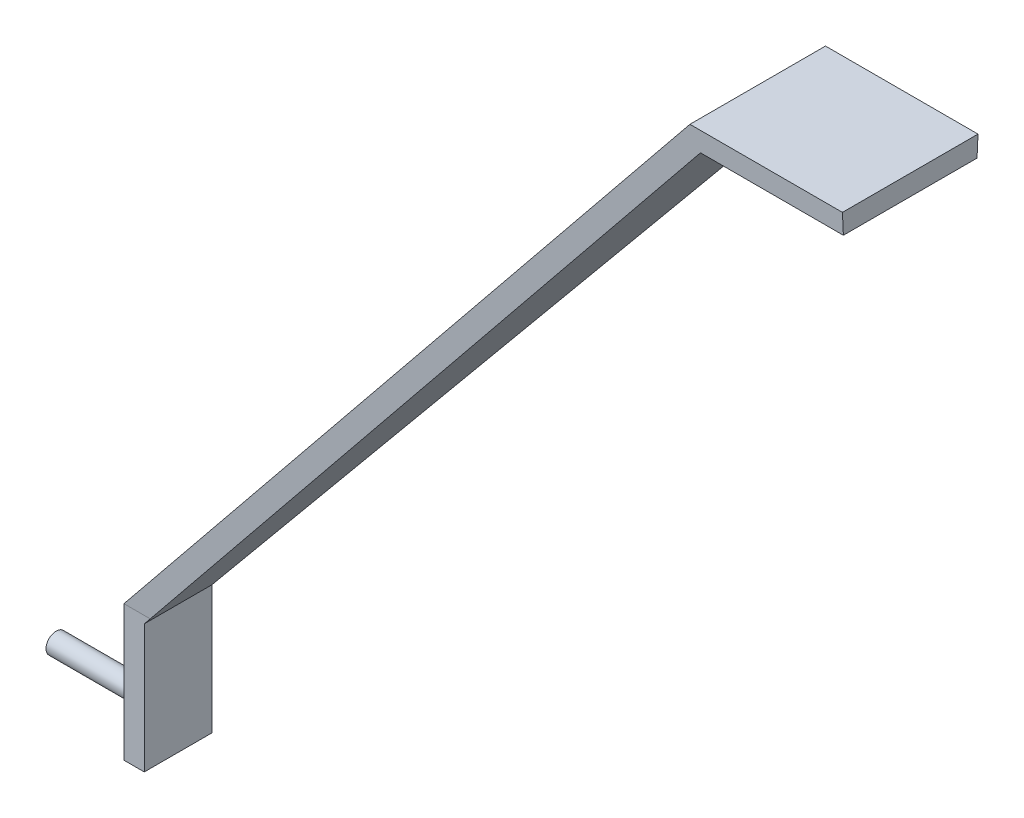
ISO-10303-21;
HEADER;
FILE_DESCRIPTION(('STEP AP214'),'2;1');
FILE_NAME('part.step','',(''),(''),'','','');
FILE_SCHEMA(('AUTOMOTIVE_DESIGN { 1 0 10303 214 1 1 1 1 }'));
ENDSEC;
DATA;
#1=APPLICATION_CONTEXT('core data for automotive mechanical design processes');
#2=APPLICATION_PROTOCOL_DEFINITION('international standard','automotive_design',2000,#1);
#3=PRODUCT_CONTEXT('',#1,'mechanical');
#4=PRODUCT('Part','Part','',(#3));
#5=PRODUCT_RELATED_PRODUCT_CATEGORY('part','',(#4));
#6=PRODUCT_DEFINITION_FORMATION('','',#4);
#7=PRODUCT_DEFINITION_CONTEXT('part definition',#1,'design');
#8=PRODUCT_DEFINITION('design','',#6,#7);
#9=PRODUCT_DEFINITION_SHAPE('','',#8);
#10=(LENGTH_UNIT() NAMED_UNIT(*) SI_UNIT(.MILLI.,.METRE.));
#11=(NAMED_UNIT(*) PLANE_ANGLE_UNIT() SI_UNIT($,.RADIAN.));
#12=(NAMED_UNIT(*) SI_UNIT($,.STERADIAN.) SOLID_ANGLE_UNIT());
#13=UNCERTAINTY_MEASURE_WITH_UNIT(LENGTH_MEASURE(1.E-05),#10,'distance_accuracy_value','');
#14=(GEOMETRIC_REPRESENTATION_CONTEXT(3) GLOBAL_UNCERTAINTY_ASSIGNED_CONTEXT((#13)) GLOBAL_UNIT_ASSIGNED_CONTEXT((#10,
#11,#12)) REPRESENTATION_CONTEXT('',''));
#15=CARTESIAN_POINT('',(0.,0.,0.));
#16=DIRECTION('',(0.,0.,1.));
#17=DIRECTION('',(1.,0.,0.));
#18=AXIS2_PLACEMENT_3D('',#15,#16,#17);
#19=CARTESIAN_POINT('',(0.,0.,20.));
#20=DIRECTION('',(0.,1.,0.));
#21=DIRECTION('',(0.,0.,1.));
#22=AXIS2_PLACEMENT_3D('',#19,#20,#21);
#23=PLANE('',#22);
#24=DIRECTION('',(1.,0.,0.));
#25=VECTOR('',#24,1.);
#26=CARTESIAN_POINT('',(0.,0.,20.));
#27=LINE('',#26,#25);
#28=CARTESIAN_POINT('',(-42.5,0.,20.));
#29=VERTEX_POINT('',#28);
#30=CARTESIAN_POINT('',(-19.9999999999999,0.,20.));
#31=VERTEX_POINT('',#30);
#32=EDGE_CURVE('E150',#29,#31,#27,.T.);
#33=ORIENTED_EDGE('',*,*,#32,.T.);
#34=DIRECTION('',(0.,0.,-1.));
#35=VECTOR('',#34,1.);
#36=CARTESIAN_POINT('',(-19.9999999999999,0.,20.));
#37=LINE('',#36,#35);
#38=CARTESIAN_POINT('',(-19.9999999999999,0.,0.));
#39=VERTEX_POINT('',#38);
#40=EDGE_CURVE('E54',#31,#39,#37,.T.);
#41=ORIENTED_EDGE('',*,*,#40,.T.);
#42=DIRECTION('',(1.,0.,0.));
#43=VECTOR('',#42,1.);
#44=CARTESIAN_POINT('',(0.,0.,0.));
#45=LINE('',#44,#43);
#46=CARTESIAN_POINT('',(-42.5,0.,0.));
#47=VERTEX_POINT('',#46);
#48=EDGE_CURVE('E149',#47,#39,#45,.T.);
#49=ORIENTED_EDGE('',*,*,#48,.F.);
#50=DIRECTION('',(0.,0.,-1.));
#51=VECTOR('',#50,1.);
#52=CARTESIAN_POINT('',(-42.5,0.,20.));
#53=LINE('',#52,#51);
#54=EDGE_CURVE('E167',#29,#47,#53,.T.);
#55=ORIENTED_EDGE('',*,*,#54,.F.);
#56=EDGE_LOOP('',(#33,#41,#49,#55));
#57=FACE_BOUND('',#56,.T.);
#58=ADVANCED_FACE('F41',(#57),#23,.T.);
#59=CARTESIAN_POINT('',(0.,-3.00000000000002,20.));
#60=DIRECTION('',(0.,-1.,0.));
#61=DIRECTION('',(0.,0.,-1.));
#62=AXIS2_PLACEMENT_3D('',#59,#60,#61);
#63=PLANE('',#62);
#64=DIRECTION('',(-1.,0.,0.));
#65=VECTOR('',#64,1.);
#66=CARTESIAN_POINT('',(0.,-3.00000000000002,0.13888888888889));
#67=LINE('',#66,#65);
#68=CARTESIAN_POINT('',(-19.9999999999999,-3.00000000000002,0.13888888888889));
#69=VERTEX_POINT('',#68);
#70=CARTESIAN_POINT('',(-41.0797507600499,-3.00000000000002,0.13888888888889));
#71=VERTEX_POINT('',#70);
#72=EDGE_CURVE('E122',#69,#71,#67,.T.);
#73=ORIENTED_EDGE('',*,*,#72,.F.);
#74=DIRECTION('',(0.,0.,1.));
#75=VECTOR('',#74,1.);
#76=CARTESIAN_POINT('',(-19.9999999999999,-3.00000000000002,20.));
#77=LINE('',#76,#75);
#78=CARTESIAN_POINT('',(-19.9999999999999,-3.00000000000002,19.8611111111111));
#79=VERTEX_POINT('',#78);
#80=EDGE_CURVE('E110',#69,#79,#77,.T.);
#81=ORIENTED_EDGE('',*,*,#80,.T.);
#82=DIRECTION('',(1.,0.,0.));
#83=VECTOR('',#82,1.);
#84=CARTESIAN_POINT('',(0.,-3.00000000000002,19.8611111111111));
#85=LINE('',#84,#83);
#86=CARTESIAN_POINT('',(-41.0797507600499,-3.00000000000002,19.8611111111111));
#87=VERTEX_POINT('',#86);
#88=EDGE_CURVE('E120',#87,#79,#85,.T.);
#89=ORIENTED_EDGE('',*,*,#88,.F.);
#90=DIRECTION('',(0.,0.,-1.));
#91=VECTOR('',#90,1.);
#92=CARTESIAN_POINT('',(-41.0797507600499,-3.00000000000002,20.));
#93=LINE('',#92,#91);
#94=EDGE_CURVE('E152',#87,#71,#93,.T.);
#95=ORIENTED_EDGE('',*,*,#94,.T.);
#96=EDGE_LOOP('',(#73,#81,#89,#95));
#97=FACE_BOUND('',#96,.T.);
#98=ADVANCED_FACE('F118',(#97),#63,.T.);
#99=CARTESIAN_POINT('',(-131.,0.,0.));
#100=DIRECTION('',(0.,0.0462467613948889,0.9989300461296));
#101=DIRECTION('',(0.,-0.9989300461296,0.0462467613948889));
#102=AXIS2_PLACEMENT_3D('',#99,#100,#101);
#103=PLANE('',#102);
#104=DIRECTION('',(0.,0.9989300461296,-0.0462467613948889));
#105=VECTOR('',#104,1.);
#106=CARTESIAN_POINT('',(-19.9999999999999,0.,0.));
#107=LINE('',#106,#105);
#108=EDGE_CURVE('E214',#69,#39,#107,.T.);
#109=ORIENTED_EDGE('',*,*,#108,.F.);
#110=ORIENTED_EDGE('',*,*,#72,.T.);
#111=DIRECTION('',(0.633416626645473,0.772983002008035,-0.0357862500929646));
#112=VECTOR('',#111,1.);
#113=CARTESIAN_POINT('',(-23.5792148710195,18.3565861696642,-0.849841952299268));
#114=LINE('',#113,#112);
#115=CARTESIAN_POINT('',(-127.121417426717,-108.,5.));
#116=VERTEX_POINT('',#115);
#117=EDGE_CURVE('E131',#116,#71,#114,.T.);
#118=ORIENTED_EDGE('',*,*,#117,.F.);
#119=DIRECTION('',(1.,0.,0.));
#120=VECTOR('',#119,1.);
#121=CARTESIAN_POINT('',(-131.,-108.,5.));
#122=LINE('',#121,#120);
#123=CARTESIAN_POINT('',(-131.,-108.,5.));
#124=VERTEX_POINT('',#123);
#125=EDGE_CURVE('E199',#124,#116,#122,.T.);
#126=ORIENTED_EDGE('',*,*,#125,.F.);
#127=DIRECTION('',(-0.633416626645473,-0.772983002008035,0.0357862500929646));
#128=VECTOR('',#127,1.);
#129=CARTESIAN_POINT('',(-25.901645642569,20.255618876865,-0.937760133188189));
#130=LINE('',#129,#128);
#131=EDGE_CURVE('E62',#47,#124,#130,.T.);
#132=ORIENTED_EDGE('',*,*,#131,.F.);
#133=ORIENTED_EDGE('',*,*,#48,.T.);
#134=EDGE_LOOP('',(#109,#110,#118,#126,#132,#133));
#135=FACE_BOUND('',#134,.T.);
#136=ADVANCED_FACE('F207',(#135),#103,.F.);
#137=CARTESIAN_POINT('',(-131.,-0.923945589870819,19.9572247412097));
#138=DIRECTION('',(0.,0.0462467613948889,-0.9989300461296));
#139=DIRECTION('',(0.,0.9989300461296,0.0462467613948889));
#140=AXIS2_PLACEMENT_3D('',#137,#138,#139);
#141=PLANE('',#140);
#142=DIRECTION('',(0.,-0.9989300461296,-0.0462467613948889));
#143=VECTOR('',#142,1.);
#144=CARTESIAN_POINT('',(-19.9999999999999,-0.923945589870819,19.9572247412097));
#145=LINE('',#144,#143);
#146=EDGE_CURVE('E11',#31,#79,#145,.T.);
#147=ORIENTED_EDGE('',*,*,#146,.F.);
#148=ORIENTED_EDGE('',*,*,#32,.F.);
#149=DIRECTION('',(0.633416626645473,0.772983002008035,0.0357862500929646));
#150=VECTOR('',#149,1.);
#151=CARTESIAN_POINT('',(-25.4482935262855,20.8088621374144,20.9633732471025));
#152=LINE('',#151,#150);
#153=CARTESIAN_POINT('',(-131.,-108.,15.));
#154=VERTEX_POINT('',#153);
#155=EDGE_CURVE('E129',#154,#29,#152,.T.);
#156=ORIENTED_EDGE('',*,*,#155,.F.);
#157=DIRECTION('',(1.,0.,0.));
#158=VECTOR('',#157,1.);
#159=CARTESIAN_POINT('',(-131.,-108.,15.));
#160=LINE('',#159,#158);
#161=CARTESIAN_POINT('',(-127.121417426717,-108.,15.));
#162=VERTEX_POINT('',#161);
#163=EDGE_CURVE('E193',#154,#162,#160,.T.);
#164=ORIENTED_EDGE('',*,*,#163,.T.);
#165=DIRECTION('',(-0.633416626645473,-0.772983002008035,-0.0357862500929646));
#166=VECTOR('',#165,1.);
#167=CARTESIAN_POINT('',(-23.125862754736,18.9098294302136,20.8754550662136));
#168=LINE('',#167,#166);
#169=EDGE_CURVE('E127',#87,#162,#168,.T.);
#170=ORIENTED_EDGE('',*,*,#169,.F.);
#171=ORIENTED_EDGE('',*,*,#88,.T.);
#172=EDGE_LOOP('',(#147,#148,#156,#164,#170,#171));
#173=FACE_BOUND('',#172,.T.);
#174=ADVANCED_FACE('F124',(#173),#141,.F.);
#175=CARTESIAN_POINT('',(-25.4264281592614,20.8355452971725,20.));
#176=DIRECTION('',(0.773478440465521,-0.633822610937024,0.));
#177=DIRECTION('',(0.633822610937024,0.773478440465521,0.));
#178=AXIS2_PLACEMENT_3D('',#175,#176,#177);
#179=PLANE('',#178);
#180=DIRECTION('',(0.,0.,-1.));
#181=VECTOR('',#180,1.);
#182=CARTESIAN_POINT('',(-131.,-108.,20.));
#183=LINE('',#182,#181);
#184=EDGE_CURVE('E164',#154,#124,#183,.T.);
#185=ORIENTED_EDGE('',*,*,#184,.F.);
#186=ORIENTED_EDGE('',*,*,#155,.T.);
#187=ORIENTED_EDGE('',*,*,#54,.T.);
#188=ORIENTED_EDGE('',*,*,#131,.T.);
#189=EDGE_LOOP('',(#185,#186,#187,#188));
#190=FACE_BOUND('',#189,.T.);
#191=ADVANCED_FACE('F177',(#190),#179,.F.);
#192=CARTESIAN_POINT('',(-131.,0.,20.));
#193=DIRECTION('',(1.,0.,0.));
#194=DIRECTION('',(0.,0.,-1.));
#195=AXIS2_PLACEMENT_3D('',#192,#193,#194);
#196=PLANE('',#195);
#197=CARTESIAN_POINT('',(-131.,-123.,10.));
#198=DIRECTION('',(1.,0.,0.));
#199=DIRECTION('',(0.,0.,-1.));
#200=AXIS2_PLACEMENT_3D('',#197,#198,#199);
#201=CIRCLE('',#200,1.5);
#202=CARTESIAN_POINT('',(-131.,-123.,8.5));
#203=VERTEX_POINT('',#202);
#204=EDGE_CURVE('E48',#203,#203,#201,.F.);
#205=ORIENTED_EDGE('',*,*,#204,.F.);
#206=EDGE_LOOP('',(#205));
#207=FACE_BOUND('',#206,.T.);
#208=DIRECTION('',(0.,0.,-1.));
#209=VECTOR('',#208,1.);
#210=CARTESIAN_POINT('',(-131.,-128.,20.));
#211=LINE('',#210,#209);
#212=CARTESIAN_POINT('',(-131.,-128.,15.));
#213=VERTEX_POINT('',#212);
#214=CARTESIAN_POINT('',(-131.,-128.,5.));
#215=VERTEX_POINT('',#214);
#216=EDGE_CURVE('E161',#213,#215,#211,.T.);
#217=ORIENTED_EDGE('',*,*,#216,.F.);
#218=DIRECTION('',(0.,1.,0.));
#219=VECTOR('',#218,1.);
#220=CARTESIAN_POINT('',(-131.,0.,15.));
#221=LINE('',#220,#219);
#222=EDGE_CURVE('E182',#213,#154,#221,.T.);
#223=ORIENTED_EDGE('',*,*,#222,.T.);
#224=ORIENTED_EDGE('',*,*,#184,.T.);
#225=DIRECTION('',(0.,-1.,0.));
#226=VECTOR('',#225,1.);
#227=CARTESIAN_POINT('',(-131.,0.,5.00000000000001));
#228=LINE('',#227,#226);
#229=EDGE_CURVE('E185',#124,#215,#228,.T.);
#230=ORIENTED_EDGE('',*,*,#229,.T.);
#231=EDGE_LOOP('',(#217,#223,#224,#230));
#232=FACE_BOUND('',#231,.T.);
#233=ADVANCED_FACE('F173',(#207,#232),#196,.F.);
#234=CARTESIAN_POINT('',(0.,-128.,20.));
#235=DIRECTION('',(0.,1.,0.));
#236=DIRECTION('',(0.,0.,1.));
#237=AXIS2_PLACEMENT_3D('',#234,#235,#236);
#238=PLANE('',#237);
#239=DIRECTION('',(0.,0.,-1.));
#240=VECTOR('',#239,1.);
#241=CARTESIAN_POINT('',(-128.,-128.,20.));
#242=LINE('',#241,#240);
#243=CARTESIAN_POINT('',(-128.,-128.,15.));
#244=VERTEX_POINT('',#243);
#245=CARTESIAN_POINT('',(-128.,-128.,5.));
#246=VERTEX_POINT('',#245);
#247=EDGE_CURVE('E158',#244,#246,#242,.T.);
#248=ORIENTED_EDGE('',*,*,#247,.F.);
#249=DIRECTION('',(1.,0.,0.));
#250=VECTOR('',#249,1.);
#251=CARTESIAN_POINT('',(-131.,-128.,15.));
#252=LINE('',#251,#250);
#253=EDGE_CURVE('E191',#213,#244,#252,.T.);
#254=ORIENTED_EDGE('',*,*,#253,.F.);
#255=ORIENTED_EDGE('',*,*,#216,.T.);
#256=DIRECTION('',(1.,0.,0.));
#257=VECTOR('',#256,1.);
#258=CARTESIAN_POINT('',(-131.,-128.,5.));
#259=LINE('',#258,#257);
#260=EDGE_CURVE('E190',#215,#246,#259,.T.);
#261=ORIENTED_EDGE('',*,*,#260,.T.);
#262=EDGE_LOOP('',(#248,#254,#255,#261));
#263=FACE_BOUND('',#262,.T.);
#264=ADVANCED_FACE('F176',(#263),#238,.F.);
#265=CARTESIAN_POINT('',(-128.,0.,20.));
#266=DIRECTION('',(-1.,0.,0.));
#267=DIRECTION('',(0.,0.,1.));
#268=AXIS2_PLACEMENT_3D('',#265,#266,#267);
#269=PLANE('',#268);
#270=DIRECTION('',(0.,0.,-1.));
#271=VECTOR('',#270,1.);
#272=CARTESIAN_POINT('',(-128.,-109.072168564007,20.));
#273=LINE('',#272,#271);
#274=CARTESIAN_POINT('',(-128.,-109.072168564007,15.));
#275=VERTEX_POINT('',#274);
#276=CARTESIAN_POINT('',(-128.,-109.072168564007,5.));
#277=VERTEX_POINT('',#276);
#278=EDGE_CURVE('E155',#275,#277,#273,.T.);
#279=ORIENTED_EDGE('',*,*,#278,.F.);
#280=DIRECTION('',(0.,-1.,0.));
#281=VECTOR('',#280,1.);
#282=CARTESIAN_POINT('',(-128.,0.,15.));
#283=LINE('',#282,#281);
#284=EDGE_CURVE('E146',#275,#244,#283,.T.);
#285=ORIENTED_EDGE('',*,*,#284,.T.);
#286=ORIENTED_EDGE('',*,*,#247,.T.);
#287=DIRECTION('',(0.,1.,0.));
#288=VECTOR('',#287,1.);
#289=CARTESIAN_POINT('',(-128.,0.,5.00000000000001));
#290=LINE('',#289,#288);
#291=EDGE_CURVE('E140',#246,#277,#290,.T.);
#292=ORIENTED_EDGE('',*,*,#291,.T.);
#293=EDGE_LOOP('',(#279,#285,#286,#292));
#294=FACE_BOUND('',#293,.T.);
#295=ADVANCED_FACE('F246',(#294),#269,.F.);
#296=CARTESIAN_POINT('',(-23.1059928378648,18.9340774643614,20.));
#297=DIRECTION('',(-0.773478440465521,0.633822610937024,0.));
#298=DIRECTION('',(-0.633822610937024,-0.773478440465521,0.));
#299=AXIS2_PLACEMENT_3D('',#296,#297,#298);
#300=PLANE('',#299);
#301=ORIENTED_EDGE('',*,*,#94,.F.);
#302=ORIENTED_EDGE('',*,*,#169,.T.);
#303=DIRECTION('',(-0.633822610937024,-0.773478440465521,0.));
#304=VECTOR('',#303,1.);
#305=CARTESIAN_POINT('',(-23.1059928378648,18.9340774643614,15.));
#306=LINE('',#305,#304);
#307=EDGE_CURVE('E143',#162,#275,#306,.T.);
#308=ORIENTED_EDGE('',*,*,#307,.T.);
#309=ORIENTED_EDGE('',*,*,#278,.T.);
#310=DIRECTION('',(0.633822610937024,0.773478440465521,0.));
#311=VECTOR('',#310,1.);
#312=CARTESIAN_POINT('',(-23.1059928378648,18.9340774643614,5.00000000000001));
#313=LINE('',#312,#311);
#314=EDGE_CURVE('E137',#277,#116,#313,.T.);
#315=ORIENTED_EDGE('',*,*,#314,.T.);
#316=ORIENTED_EDGE('',*,*,#117,.T.);
#317=EDGE_LOOP('',(#301,#302,#308,#309,#315,#316));
#318=FACE_BOUND('',#317,.T.);
#319=ADVANCED_FACE('F206',(#318),#300,.F.);
#320=CARTESIAN_POINT('',(-131.,0.,5.00000000000001));
#321=DIRECTION('',(0.,0.,1.));
#322=DIRECTION('',(0.,-1.,0.));
#323=AXIS2_PLACEMENT_3D('',#320,#321,#322);
#324=PLANE('',#323);
#325=ORIENTED_EDGE('',*,*,#260,.F.);
#326=ORIENTED_EDGE('',*,*,#229,.F.);
#327=ORIENTED_EDGE('',*,*,#125,.T.);
#328=ORIENTED_EDGE('',*,*,#314,.F.);
#329=ORIENTED_EDGE('',*,*,#291,.F.);
#330=EDGE_LOOP('',(#325,#326,#327,#328,#329));
#331=FACE_BOUND('',#330,.T.);
#332=ADVANCED_FACE('F209',(#331),#324,.F.);
#333=CARTESIAN_POINT('',(-131.,0.,15.));
#334=DIRECTION('',(0.,0.,-1.));
#335=DIRECTION('',(-1.,0.,0.));
#336=AXIS2_PLACEMENT_3D('',#333,#334,#335);
#337=PLANE('',#336);
#338=ORIENTED_EDGE('',*,*,#307,.F.);
#339=ORIENTED_EDGE('',*,*,#163,.F.);
#340=ORIENTED_EDGE('',*,*,#222,.F.);
#341=ORIENTED_EDGE('',*,*,#253,.T.);
#342=ORIENTED_EDGE('',*,*,#284,.F.);
#343=EDGE_LOOP('',(#338,#339,#340,#341,#342));
#344=FACE_BOUND('',#343,.T.);
#345=ADVANCED_FACE('F224',(#344),#337,.F.);
#346=CARTESIAN_POINT('',(-146.,-123.,10.));
#347=DIRECTION('',(1.,0.,0.));
#348=DIRECTION('',(0.,0.,-1.));
#349=AXIS2_PLACEMENT_3D('',#346,#347,#348);
#350=CYLINDRICAL_SURFACE('',#349,1.5);
#351=CARTESIAN_POINT('',(-146.,-123.,10.));
#352=DIRECTION('',(-1.,0.,0.));
#353=DIRECTION('',(0.,0.,1.));
#354=AXIS2_PLACEMENT_3D('',#351,#352,#353);
#355=CIRCLE('',#354,1.5);
#356=CARTESIAN_POINT('',(-146.,-123.,11.5));
#357=VERTEX_POINT('',#356);
#358=EDGE_CURVE('E200',#357,#357,#355,.T.);
#359=ORIENTED_EDGE('',*,*,#358,.F.);
#360=EDGE_LOOP('',(#359));
#361=FACE_BOUND('',#360,.T.);
#362=ORIENTED_EDGE('',*,*,#204,.T.);
#363=EDGE_LOOP('',(#362));
#364=FACE_BOUND('',#363,.T.);
#365=ADVANCED_FACE('F171',(#361,#364),#350,.T.);
#366=CARTESIAN_POINT('',(-146.,-123.,10.));
#367=DIRECTION('',(-1.,0.,0.));
#368=DIRECTION('',(0.,0.,1.));
#369=AXIS2_PLACEMENT_3D('',#366,#367,#368);
#370=PLANE('',#369);
#371=ORIENTED_EDGE('',*,*,#358,.T.);
#372=EDGE_LOOP('',(#371));
#373=FACE_BOUND('',#372,.T.);
#374=ADVANCED_FACE('F221',(#373),#370,.T.);
#375=CARTESIAN_POINT('',(-19.9999999999999,0.,0.));
#376=DIRECTION('',(1.,0.,0.));
#377=DIRECTION('',(0.,0.,-1.));
#378=AXIS2_PLACEMENT_3D('',#375,#376,#377);
#379=PLANE('',#378);
#380=ORIENTED_EDGE('',*,*,#108,.T.);
#381=ORIENTED_EDGE('',*,*,#40,.F.);
#382=ORIENTED_EDGE('',*,*,#146,.T.);
#383=ORIENTED_EDGE('',*,*,#80,.F.);
#384=EDGE_LOOP('',(#380,#381,#382,#383));
#385=FACE_BOUND('',#384,.T.);
#386=ADVANCED_FACE('F109',(#385),#379,.T.);
#387=CLOSED_SHELL('',(#58,#98,#136,#174,#191,#233,#264,#295,#319,#332,#345,#365,#374,#386));
#388=MANIFOLD_SOLID_BREP('B2',#387);
#389=ADVANCED_BREP_SHAPE_REPRESENTATION('',(#18,#388),#14);
#390=SHAPE_DEFINITION_REPRESENTATION(#9,#389);
ENDSEC;
END-ISO-10303-21;
